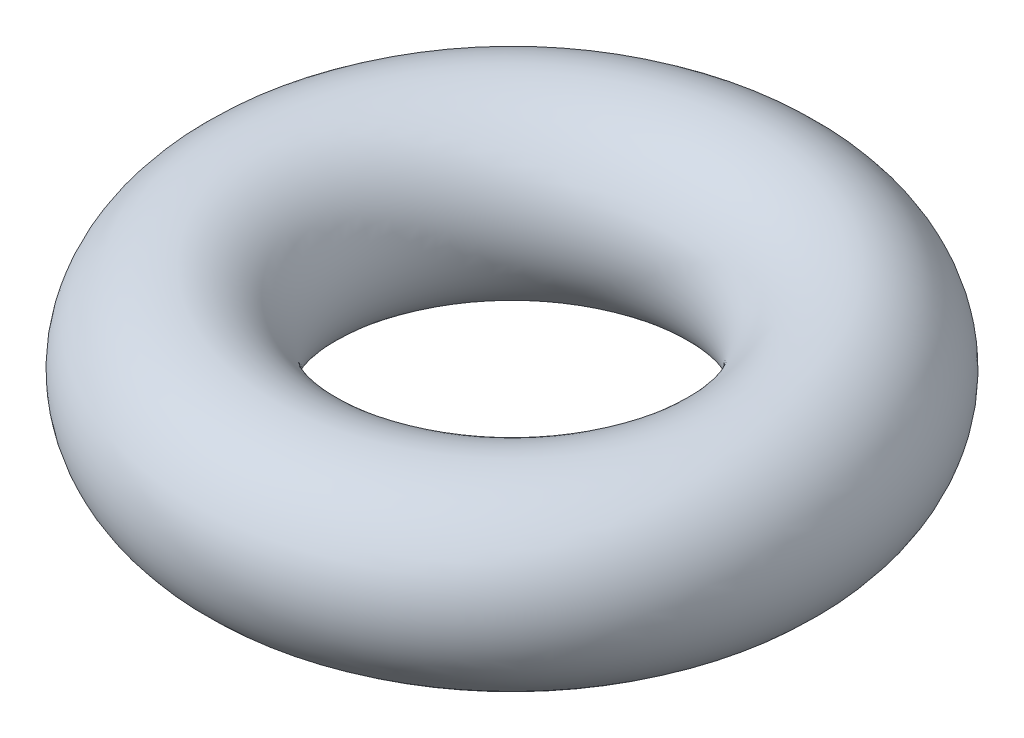
ISO-10303-21;
HEADER;
FILE_DESCRIPTION(('STEP AP214'),'2;1');
FILE_NAME('part.step','',(''),(''),'','','');
FILE_SCHEMA(('AUTOMOTIVE_DESIGN { 1 0 10303 214 1 1 1 1 }'));
ENDSEC;
DATA;
#1=APPLICATION_CONTEXT('core data for automotive mechanical design processes');
#2=APPLICATION_PROTOCOL_DEFINITION('international standard','automotive_design',2000,#1);
#3=PRODUCT_CONTEXT('',#1,'mechanical');
#4=PRODUCT('Part','Part','',(#3));
#5=PRODUCT_RELATED_PRODUCT_CATEGORY('part','',(#4));
#6=PRODUCT_DEFINITION_FORMATION('','',#4);
#7=PRODUCT_DEFINITION_CONTEXT('part definition',#1,'design');
#8=PRODUCT_DEFINITION('design','',#6,#7);
#9=PRODUCT_DEFINITION_SHAPE('','',#8);
#10=(LENGTH_UNIT() NAMED_UNIT(*) SI_UNIT(.MILLI.,.METRE.));
#11=(NAMED_UNIT(*) PLANE_ANGLE_UNIT() SI_UNIT($,.RADIAN.));
#12=(NAMED_UNIT(*) SI_UNIT($,.STERADIAN.) SOLID_ANGLE_UNIT());
#13=UNCERTAINTY_MEASURE_WITH_UNIT(LENGTH_MEASURE(1.E-05),#10,'distance_accuracy_value','');
#14=(GEOMETRIC_REPRESENTATION_CONTEXT(3) GLOBAL_UNCERTAINTY_ASSIGNED_CONTEXT((#13)) GLOBAL_UNIT_ASSIGNED_CONTEXT((#10,
#11,#12)) REPRESENTATION_CONTEXT('',''));
#15=CARTESIAN_POINT('',(0.,0.,0.));
#16=DIRECTION('',(0.,0.,1.));
#17=DIRECTION('',(1.,0.,0.));
#18=AXIS2_PLACEMENT_3D('',#15,#16,#17);
#19=CARTESIAN_POINT('',(0.,0.,0.));
#20=DIRECTION('',(0.,-1.,0.));
#21=DIRECTION('',(1.,0.,0.));
#22=AXIS2_PLACEMENT_3D('',#19,#20,#21);
#23=TOROIDAL_SURFACE('',#22,40.,15.);
#24=CARTESIAN_POINT('',(55.,0.,0.));
#25=VERTEX_POINT('',#24);
#26=VERTEX_LOOP('',#25);
#27=FACE_BOUND('',#26,.T.);
#28=ADVANCED_FACE('F33',(#27),#23,.T.);
#29=CLOSED_SHELL('',(#28));
#30=MANIFOLD_SOLID_BREP('B2',#29);
#31=ADVANCED_BREP_SHAPE_REPRESENTATION('',(#18,#30),#14);
#32=SHAPE_DEFINITION_REPRESENTATION(#9,#31);
ENDSEC;
END-ISO-10303-21;
